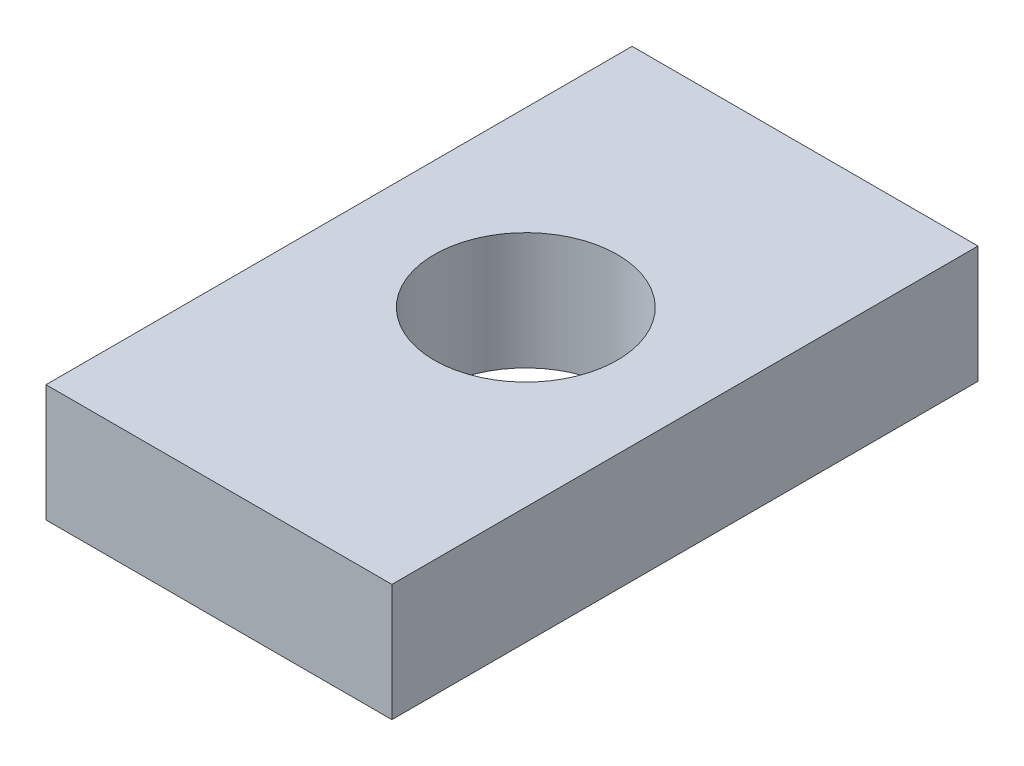
ISO-10303-21;
HEADER;
FILE_DESCRIPTION(('STEP AP214'),'2;1');
FILE_NAME('part.step','',(''),(''),'','','');
FILE_SCHEMA(('AUTOMOTIVE_DESIGN { 1 0 10303 214 1 1 1 1 }'));
ENDSEC;
DATA;
#1=APPLICATION_CONTEXT('core data for automotive mechanical design processes');
#2=APPLICATION_PROTOCOL_DEFINITION('international standard','automotive_design',2000,#1);
#3=PRODUCT_CONTEXT('',#1,'mechanical');
#4=PRODUCT('Part','Part','',(#3));
#5=PRODUCT_RELATED_PRODUCT_CATEGORY('part','',(#4));
#6=PRODUCT_DEFINITION_FORMATION('','',#4);
#7=PRODUCT_DEFINITION_CONTEXT('part definition',#1,'design');
#8=PRODUCT_DEFINITION('design','',#6,#7);
#9=PRODUCT_DEFINITION_SHAPE('','',#8);
#10=(LENGTH_UNIT() NAMED_UNIT(*) SI_UNIT(.MILLI.,.METRE.));
#11=(NAMED_UNIT(*) PLANE_ANGLE_UNIT() SI_UNIT($,.RADIAN.));
#12=(NAMED_UNIT(*) SI_UNIT($,.STERADIAN.) SOLID_ANGLE_UNIT());
#13=UNCERTAINTY_MEASURE_WITH_UNIT(LENGTH_MEASURE(1.E-05),#10,'distance_accuracy_value','');
#14=(GEOMETRIC_REPRESENTATION_CONTEXT(3) GLOBAL_UNCERTAINTY_ASSIGNED_CONTEXT((#13)) GLOBAL_UNIT_ASSIGNED_CONTEXT((#10,
#11,#12)) REPRESENTATION_CONTEXT('',''));
#15=CARTESIAN_POINT('',(0.,0.,0.));
#16=DIRECTION('',(0.,0.,1.));
#17=DIRECTION('',(1.,0.,0.));
#18=AXIS2_PLACEMENT_3D('',#15,#16,#17);
#19=CARTESIAN_POINT('',(0.,10.,0.));
#20=DIRECTION('',(0.,-1.,0.));
#21=DIRECTION('',(0.,0.,-1.));
#22=AXIS2_PLACEMENT_3D('',#19,#20,#21);
#23=PLANE('',#22);
#24=DIRECTION('',(0.,0.,1.));
#25=VECTOR('',#24,1.);
#26=CARTESIAN_POINT('',(0.,10.,0.));
#27=LINE('',#26,#25);
#28=CARTESIAN_POINT('',(0.,10.,-50.0183461849334));
#29=VERTEX_POINT('',#28);
#30=CARTESIAN_POINT('',(0.,10.,0.));
#31=VERTEX_POINT('',#30);
#32=EDGE_CURVE('E102',#29,#31,#27,.T.);
#33=ORIENTED_EDGE('',*,*,#32,.T.);
#34=DIRECTION('',(1.,0.,0.));
#35=VECTOR('',#34,1.);
#36=CARTESIAN_POINT('',(0.,10.,0.));
#37=LINE('',#36,#35);
#38=CARTESIAN_POINT('',(29.5208501982346,10.,0.));
#39=VERTEX_POINT('',#38);
#40=EDGE_CURVE('E96',#31,#39,#37,.T.);
#41=ORIENTED_EDGE('',*,*,#40,.T.);
#42=DIRECTION('',(0.,0.,-1.));
#43=VECTOR('',#42,1.);
#44=CARTESIAN_POINT('',(29.5208501982346,10.,0.));
#45=LINE('',#44,#43);
#46=CARTESIAN_POINT('',(29.5208501982346,10.,-50.0183461849334));
#47=VERTEX_POINT('',#46);
#48=EDGE_CURVE('E98',#39,#47,#45,.T.);
#49=ORIENTED_EDGE('',*,*,#48,.T.);
#50=DIRECTION('',(-1.,0.,0.));
#51=VECTOR('',#50,1.);
#52=CARTESIAN_POINT('',(0.,10.,-50.0183461849334));
#53=LINE('',#52,#51);
#54=EDGE_CURVE('E67',#47,#29,#53,.T.);
#55=ORIENTED_EDGE('',*,*,#54,.T.);
#56=EDGE_LOOP('',(#33,#41,#49,#55));
#57=FACE_BOUND('',#56,.T.);
#58=CARTESIAN_POINT('',(14.7604250991173,10.000012,-26.1874615773886));
#59=DIRECTION('',(0.,1.,0.));
#60=DIRECTION('',(0.,0.,1.));
#61=AXIS2_PLACEMENT_3D('',#58,#59,#60);
#62=CIRCLE('',#61,7.81261859103329);
#63=CARTESIAN_POINT('',(14.7604250991173,10.000012,-18.3748429863553));
#64=VERTEX_POINT('',#63);
#65=EDGE_CURVE('E125',#64,#64,#62,.T.);
#66=ORIENTED_EDGE('',*,*,#65,.F.);
#67=EDGE_LOOP('',(#66));
#68=FACE_BOUND('',#67,.T.);
#69=ADVANCED_FACE('F44',(#57,#68),#23,.F.);
#70=CARTESIAN_POINT('',(0.,10.,0.));
#71=DIRECTION('',(1.,0.,0.));
#72=DIRECTION('',(0.,0.,-1.));
#73=AXIS2_PLACEMENT_3D('',#70,#71,#72);
#74=PLANE('',#73);
#75=DIRECTION('',(0.,0.,1.));
#76=VECTOR('',#75,1.);
#77=CARTESIAN_POINT('',(0.,0.,0.));
#78=LINE('',#77,#76);
#79=CARTESIAN_POINT('',(0.,0.,-50.0183461849334));
#80=VERTEX_POINT('',#79);
#81=CARTESIAN_POINT('',(0.,0.,0.));
#82=VERTEX_POINT('',#81);
#83=EDGE_CURVE('E114',#80,#82,#78,.T.);
#84=ORIENTED_EDGE('',*,*,#83,.T.);
#85=DIRECTION('',(0.,-1.,0.));
#86=VECTOR('',#85,1.);
#87=CARTESIAN_POINT('',(0.,10.,0.));
#88=LINE('',#87,#86);
#89=EDGE_CURVE('E11',#31,#82,#88,.T.);
#90=ORIENTED_EDGE('',*,*,#89,.F.);
#91=ORIENTED_EDGE('',*,*,#32,.F.);
#92=DIRECTION('',(0.,-1.,0.));
#93=VECTOR('',#92,1.);
#94=CARTESIAN_POINT('',(0.,10.,-50.0183461849334));
#95=LINE('',#94,#93);
#96=EDGE_CURVE('E106',#29,#80,#95,.T.);
#97=ORIENTED_EDGE('',*,*,#96,.T.);
#98=EDGE_LOOP('',(#84,#90,#91,#97));
#99=FACE_BOUND('',#98,.T.);
#100=ADVANCED_FACE('F50',(#99),#74,.F.);
#101=CARTESIAN_POINT('',(0.,10.,0.));
#102=DIRECTION('',(0.,0.,-1.));
#103=DIRECTION('',(-1.,0.,0.));
#104=AXIS2_PLACEMENT_3D('',#101,#102,#103);
#105=PLANE('',#104);
#106=DIRECTION('',(1.,0.,0.));
#107=VECTOR('',#106,1.);
#108=CARTESIAN_POINT('',(0.,0.,0.));
#109=LINE('',#108,#107);
#110=CARTESIAN_POINT('',(29.5208501982346,0.,0.));
#111=VERTEX_POINT('',#110);
#112=EDGE_CURVE('E103',#82,#111,#109,.T.);
#113=ORIENTED_EDGE('',*,*,#112,.T.);
#114=DIRECTION('',(0.,-1.,0.));
#115=VECTOR('',#114,1.);
#116=CARTESIAN_POINT('',(29.5208501982346,10.,0.));
#117=LINE('',#116,#115);
#118=EDGE_CURVE('E60',#39,#111,#117,.T.);
#119=ORIENTED_EDGE('',*,*,#118,.F.);
#120=ORIENTED_EDGE('',*,*,#40,.F.);
#121=ORIENTED_EDGE('',*,*,#89,.T.);
#122=EDGE_LOOP('',(#113,#119,#120,#121));
#123=FACE_BOUND('',#122,.T.);
#124=ADVANCED_FACE('F101',(#123),#105,.F.);
#125=CARTESIAN_POINT('',(29.5208501982346,10.,0.));
#126=DIRECTION('',(-1.,0.,0.));
#127=DIRECTION('',(0.,0.,1.));
#128=AXIS2_PLACEMENT_3D('',#125,#126,#127);
#129=PLANE('',#128);
#130=DIRECTION('',(0.,0.,-1.));
#131=VECTOR('',#130,1.);
#132=CARTESIAN_POINT('',(29.5208501982346,0.,0.));
#133=LINE('',#132,#131);
#134=CARTESIAN_POINT('',(29.5208501982346,0.,-50.0183461849334));
#135=VERTEX_POINT('',#134);
#136=EDGE_CURVE('E81',#111,#135,#133,.T.);
#137=ORIENTED_EDGE('',*,*,#136,.T.);
#138=DIRECTION('',(0.,-1.,0.));
#139=VECTOR('',#138,1.);
#140=CARTESIAN_POINT('',(29.5208501982346,10.,-50.0183461849334));
#141=LINE('',#140,#139);
#142=EDGE_CURVE('E107',#47,#135,#141,.T.);
#143=ORIENTED_EDGE('',*,*,#142,.F.);
#144=ORIENTED_EDGE('',*,*,#48,.F.);
#145=ORIENTED_EDGE('',*,*,#118,.T.);
#146=EDGE_LOOP('',(#137,#143,#144,#145));
#147=FACE_BOUND('',#146,.T.);
#148=ADVANCED_FACE('F108',(#147),#129,.F.);
#149=CARTESIAN_POINT('',(0.,10.,-50.0183461849334));
#150=DIRECTION('',(0.,0.,1.));
#151=DIRECTION('',(1.,0.,0.));
#152=AXIS2_PLACEMENT_3D('',#149,#150,#151);
#153=PLANE('',#152);
#154=DIRECTION('',(-1.,0.,0.));
#155=VECTOR('',#154,1.);
#156=CARTESIAN_POINT('',(0.,0.,-50.0183461849334));
#157=LINE('',#156,#155);
#158=EDGE_CURVE('E87',#135,#80,#157,.T.);
#159=ORIENTED_EDGE('',*,*,#158,.T.);
#160=ORIENTED_EDGE('',*,*,#96,.F.);
#161=ORIENTED_EDGE('',*,*,#54,.F.);
#162=ORIENTED_EDGE('',*,*,#142,.T.);
#163=EDGE_LOOP('',(#159,#160,#161,#162));
#164=FACE_BOUND('',#163,.T.);
#165=ADVANCED_FACE('F148',(#164),#153,.F.);
#166=CARTESIAN_POINT('',(0.,0.,0.));
#167=DIRECTION('',(0.,-1.,0.));
#168=DIRECTION('',(0.,0.,-1.));
#169=AXIS2_PLACEMENT_3D('',#166,#167,#168);
#170=PLANE('',#169);
#171=CARTESIAN_POINT('',(14.7604250991173,0.,-26.1874615773886));
#172=DIRECTION('',(0.,1.,0.));
#173=DIRECTION('',(0.,0.,1.));
#174=AXIS2_PLACEMENT_3D('',#171,#172,#173);
#175=CIRCLE('',#174,7.81261859103329);
#176=CARTESIAN_POINT('',(14.7604250991173,0.,-18.3748429863553));
#177=VERTEX_POINT('',#176);
#178=EDGE_CURVE('E120',#177,#177,#175,.T.);
#179=ORIENTED_EDGE('',*,*,#178,.T.);
#180=EDGE_LOOP('',(#179));
#181=FACE_BOUND('',#180,.T.);
#182=ORIENTED_EDGE('',*,*,#83,.F.);
#183=ORIENTED_EDGE('',*,*,#158,.F.);
#184=ORIENTED_EDGE('',*,*,#136,.F.);
#185=ORIENTED_EDGE('',*,*,#112,.F.);
#186=EDGE_LOOP('',(#182,#183,#184,#185));
#187=FACE_BOUND('',#186,.T.);
#188=ADVANCED_FACE('F142',(#181,#187),#170,.T.);
#189=CARTESIAN_POINT('',(14.7604250991173,0.,-26.1874615773886));
#190=DIRECTION('',(0.,1.,0.));
#191=DIRECTION('',(0.,0.,1.));
#192=AXIS2_PLACEMENT_3D('',#189,#190,#191);
#193=CYLINDRICAL_SURFACE('',#192,7.81261859103329);
#194=ORIENTED_EDGE('',*,*,#178,.F.);
#195=EDGE_LOOP('',(#194));
#196=FACE_BOUND('',#195,.T.);
#197=ORIENTED_EDGE('',*,*,#65,.T.);
#198=EDGE_LOOP('',(#197));
#199=FACE_BOUND('',#198,.T.);
#200=ADVANCED_FACE('F134',(#196,#199),#193,.F.);
#201=CLOSED_SHELL('',(#69,#100,#124,#148,#165,#188,#200));
#202=MANIFOLD_SOLID_BREP('B2',#201);
#203=ADVANCED_BREP_SHAPE_REPRESENTATION('',(#18,#202),#14);
#204=SHAPE_DEFINITION_REPRESENTATION(#9,#203);
ENDSEC;
END-ISO-10303-21;
